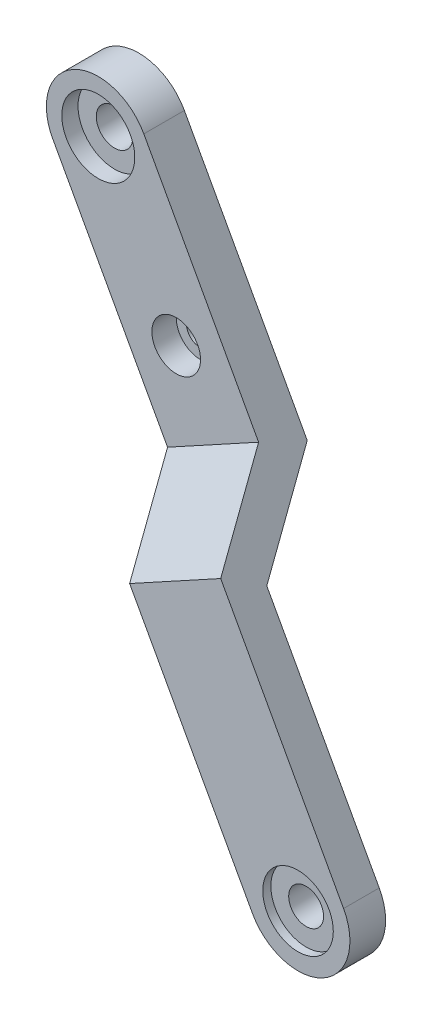
ISO-10303-21;
HEADER;
FILE_DESCRIPTION(('STEP AP214'),'2;1');
FILE_NAME('part.step','',(''),(''),'','','');
FILE_SCHEMA(('AUTOMOTIVE_DESIGN { 1 0 10303 214 1 1 1 1 }'));
ENDSEC;
DATA;
#1=APPLICATION_CONTEXT('core data for automotive mechanical design processes');
#2=APPLICATION_PROTOCOL_DEFINITION('international standard','automotive_design',2000,#1);
#3=PRODUCT_CONTEXT('',#1,'mechanical');
#4=PRODUCT('Part','Part','',(#3));
#5=PRODUCT_RELATED_PRODUCT_CATEGORY('part','',(#4));
#6=PRODUCT_DEFINITION_FORMATION('','',#4);
#7=PRODUCT_DEFINITION_CONTEXT('part definition',#1,'design');
#8=PRODUCT_DEFINITION('design','',#6,#7);
#9=PRODUCT_DEFINITION_SHAPE('','',#8);
#10=(LENGTH_UNIT() NAMED_UNIT(*) SI_UNIT(.MILLI.,.METRE.));
#11=(NAMED_UNIT(*) PLANE_ANGLE_UNIT() SI_UNIT($,.RADIAN.));
#12=(NAMED_UNIT(*) SI_UNIT($,.STERADIAN.) SOLID_ANGLE_UNIT());
#13=UNCERTAINTY_MEASURE_WITH_UNIT(LENGTH_MEASURE(1.E-05),#10,'distance_accuracy_value','');
#14=(GEOMETRIC_REPRESENTATION_CONTEXT(3) GLOBAL_UNCERTAINTY_ASSIGNED_CONTEXT((#13)) GLOBAL_UNIT_ASSIGNED_CONTEXT((#10,
#11,#12)) REPRESENTATION_CONTEXT('',''));
#15=CARTESIAN_POINT('',(0.,0.,0.));
#16=DIRECTION('',(0.,0.,1.));
#17=DIRECTION('',(1.,0.,0.));
#18=AXIS2_PLACEMENT_3D('',#15,#16,#17);
#19=CARTESIAN_POINT('',(17.7118385756911,-30.1579272278413,13.));
#20=DIRECTION('',(0.,0.,1.));
#21=DIRECTION('',(1.,0.,0.));
#22=AXIS2_PLACEMENT_3D('',#19,#20,#21);
#23=PLANE('',#22);
#24=CARTESIAN_POINT('',(17.7118385756911,-30.1579272278413,13.));
#25=DIRECTION('',(0.,0.,-1.));
#26=DIRECTION('',(0.,1.,0.));
#27=AXIS2_PLACEMENT_3D('',#24,#25,#26);
#28=CIRCLE('',#27,2.15);
#29=CARTESIAN_POINT('',(17.7118385756911,-28.0079272278413,13.));
#30=VERTEX_POINT('',#29);
#31=EDGE_CURVE('E150',#30,#30,#28,.T.);
#32=ORIENTED_EDGE('',*,*,#31,.T.);
#33=EDGE_LOOP('',(#32));
#34=FACE_BOUND('',#33,.T.);
#35=CARTESIAN_POINT('',(17.7118385756911,-30.1579272278413,13.));
#36=DIRECTION('',(0.,0.,1.));
#37=DIRECTION('',(1.,0.,0.));
#38=AXIS2_PLACEMENT_3D('',#35,#36,#37);
#39=CIRCLE('',#38,4.35);
#40=CARTESIAN_POINT('',(22.0618385756911,-30.1579272278413,13.));
#41=VERTEX_POINT('',#40);
#42=EDGE_CURVE('E19',#41,#41,#39,.T.);
#43=ORIENTED_EDGE('',*,*,#42,.T.);
#44=EDGE_LOOP('',(#43));
#45=FACE_BOUND('',#44,.T.);
#46=ADVANCED_FACE('F16',(#34,#45),#23,.T.);
#47=CARTESIAN_POINT('',(-6.30536368791014,13.6960805186492,2.00000000000001));
#48=DIRECTION('',(0.,0.,1.));
#49=DIRECTION('',(1.,0.,0.));
#50=AXIS2_PLACEMENT_3D('',#47,#48,#49);
#51=CYLINDRICAL_SURFACE('',#50,3.);
#52=CARTESIAN_POINT('',(-6.30536368791014,13.6960805186492,2.00000000000001));
#53=DIRECTION('',(0.,0.,1.));
#54=DIRECTION('',(1.,0.,0.));
#55=AXIS2_PLACEMENT_3D('',#52,#53,#54);
#56=CIRCLE('',#55,3.);
#57=CARTESIAN_POINT('',(-3.30536368791014,13.6960805186492,2.00000000000001));
#58=VERTEX_POINT('',#57);
#59=EDGE_CURVE('E148',#58,#58,#56,.T.);
#60=ORIENTED_EDGE('',*,*,#59,.F.);
#61=EDGE_LOOP('',(#60));
#62=FACE_BOUND('',#61,.T.);
#63=CARTESIAN_POINT('',(-6.30536368791014,13.6960805186492,5.00000000000001));
#64=DIRECTION('',(0.,0.,1.));
#65=DIRECTION('',(1.,0.,0.));
#66=AXIS2_PLACEMENT_3D('',#63,#64,#65);
#67=CIRCLE('',#66,3.);
#68=CARTESIAN_POINT('',(-3.30536368791014,13.6960805186492,5.00000000000001));
#69=VERTEX_POINT('',#68);
#70=EDGE_CURVE('E142',#69,#69,#67,.T.);
#71=ORIENTED_EDGE('',*,*,#70,.T.);
#72=EDGE_LOOP('',(#71));
#73=FACE_BOUND('',#72,.T.);
#74=ADVANCED_FACE('F172',(#62,#73),#51,.F.);
#75=CARTESIAN_POINT('',(-15.9122445933508,31.2376836172453,14.));
#76=DIRECTION('',(0.,0.,-1.));
#77=DIRECTION('',(-1.,0.,0.));
#78=AXIS2_PLACEMENT_3D('',#75,#76,#77);
#79=CYLINDRICAL_SURFACE('',#78,4.5);
#80=CARTESIAN_POINT('',(-15.9122445933508,31.2376836172453,5.));
#81=DIRECTION('',(0.,0.,-1.));
#82=DIRECTION('',(-1.,0.,0.));
#83=AXIS2_PLACEMENT_3D('',#80,#81,#82);
#84=CIRCLE('',#83,4.5);
#85=CARTESIAN_POINT('',(-20.4122445933508,31.2376836172453,5.));
#86=VERTEX_POINT('',#85);
#87=EDGE_CURVE('E139',#86,#86,#84,.F.);
#88=ORIENTED_EDGE('',*,*,#87,.T.);
#89=EDGE_LOOP('',(#88));
#90=FACE_BOUND('',#89,.T.);
#91=CARTESIAN_POINT('',(-15.9122445933508,31.2376836172453,3.));
#92=DIRECTION('',(0.,0.,-1.));
#93=DIRECTION('',(-1.,0.,0.));
#94=AXIS2_PLACEMENT_3D('',#91,#92,#93);
#95=CIRCLE('',#94,4.5);
#96=CARTESIAN_POINT('',(-20.4122445933508,31.2376836172453,3.));
#97=VERTEX_POINT('',#96);
#98=EDGE_CURVE('E145',#97,#97,#95,.F.);
#99=ORIENTED_EDGE('',*,*,#98,.F.);
#100=EDGE_LOOP('',(#99));
#101=FACE_BOUND('',#100,.T.);
#102=ADVANCED_FACE('F161',(#90,#101),#79,.F.);
#103=CARTESIAN_POINT('',(17.7118385756911,-30.1579272278413,13.));
#104=DIRECTION('',(0.,0.,1.));
#105=DIRECTION('',(1.,0.,0.));
#106=AXIS2_PLACEMENT_3D('',#103,#104,#105);
#107=CYLINDRICAL_SURFACE('',#106,4.35);
#108=CARTESIAN_POINT('',(17.7118385756911,-30.1579272278413,14.));
#109=DIRECTION('',(0.,0.,1.));
#110=DIRECTION('',(1.,0.,0.));
#111=AXIS2_PLACEMENT_3D('',#108,#109,#110);
#112=CIRCLE('',#111,4.35);
#113=CARTESIAN_POINT('',(22.0618385756911,-30.1579272278413,14.));
#114=VERTEX_POINT('',#113);
#115=EDGE_CURVE('E135',#114,#114,#112,.F.);
#116=ORIENTED_EDGE('',*,*,#115,.F.);
#117=EDGE_LOOP('',(#116));
#118=FACE_BOUND('',#117,.T.);
#119=ORIENTED_EDGE('',*,*,#42,.F.);
#120=EDGE_LOOP('',(#119));
#121=FACE_BOUND('',#120,.T.);
#122=ADVANCED_FACE('F158',(#118,#121),#107,.F.);
#123=CARTESIAN_POINT('',(17.7118385756911,-30.1579272278413,19.6));
#124=DIRECTION('',(0.,0.,-1.));
#125=DIRECTION('',(0.,1.,0.));
#126=AXIS2_PLACEMENT_3D('',#123,#124,#125);
#127=CYLINDRICAL_SURFACE('',#126,2.15);
#128=CARTESIAN_POINT('',(17.7118385756911,-30.1579272278413,9.60000000000001));
#129=DIRECTION('',(0.,0.,-1.));
#130=DIRECTION('',(0.,1.,0.));
#131=AXIS2_PLACEMENT_3D('',#128,#129,#130);
#132=CIRCLE('',#131,2.15);
#133=CARTESIAN_POINT('',(17.7118385756911,-28.0079272278413,9.60000000000001));
#134=VERTEX_POINT('',#133);
#135=EDGE_CURVE('E97',#134,#134,#132,.F.);
#136=ORIENTED_EDGE('',*,*,#135,.F.);
#137=EDGE_LOOP('',(#136));
#138=FACE_BOUND('',#137,.T.);
#139=ORIENTED_EDGE('',*,*,#31,.F.);
#140=EDGE_LOOP('',(#139));
#141=FACE_BOUND('',#140,.T.);
#142=ADVANCED_FACE('F160',(#138,#141),#127,.F.);
#143=CARTESIAN_POINT('',(-6.30536368791014,13.6960805186492,2.00000000000001));
#144=DIRECTION('',(0.,0.,1.));
#145=DIRECTION('',(1.,0.,0.));
#146=AXIS2_PLACEMENT_3D('',#143,#144,#145);
#147=PLANE('',#146);
#148=ORIENTED_EDGE('',*,*,#59,.T.);
#149=EDGE_LOOP('',(#148));
#150=FACE_BOUND('',#149,.T.);
#151=CARTESIAN_POINT('',(-6.30536368791014,13.6960805186492,2.00000000000001));
#152=DIRECTION('',(0.,0.,1.));
#153=DIRECTION('',(1.,0.,0.));
#154=AXIS2_PLACEMENT_3D('',#151,#152,#153);
#155=CIRCLE('',#154,1.75);
#156=CARTESIAN_POINT('',(-4.55536368791014,13.6960805186492,2.00000000000001));
#157=VERTEX_POINT('',#156);
#158=EDGE_CURVE('E129',#157,#157,#155,.F.);
#159=ORIENTED_EDGE('',*,*,#158,.T.);
#160=EDGE_LOOP('',(#159));
#161=FACE_BOUND('',#160,.T.);
#162=ADVANCED_FACE('F169',(#150,#161),#147,.T.);
#163=CARTESIAN_POINT('',(0.,0.,3.));
#164=DIRECTION('',(0.,0.,1.));
#165=DIRECTION('',(1.,0.,0.));
#166=AXIS2_PLACEMENT_3D('',#163,#164,#165);
#167=PLANE('',#166);
#168=CARTESIAN_POINT('',(-15.9122445933508,31.2376836172453,3.));
#169=DIRECTION('',(0.,0.,-1.));
#170=DIRECTION('',(-1.,0.,0.));
#171=AXIS2_PLACEMENT_3D('',#168,#169,#170);
#172=CIRCLE('',#171,2.25);
#173=CARTESIAN_POINT('',(-18.1622445933508,31.2376836172453,3.));
#174=VERTEX_POINT('',#173);
#175=EDGE_CURVE('E125',#174,#174,#172,.T.);
#176=ORIENTED_EDGE('',*,*,#175,.T.);
#177=EDGE_LOOP('',(#176));
#178=FACE_BOUND('',#177,.T.);
#179=ORIENTED_EDGE('',*,*,#98,.T.);
#180=EDGE_LOOP('',(#179));
#181=FACE_BOUND('',#180,.T.);
#182=ADVANCED_FACE('F221',(#178,#181),#167,.T.);
#183=CARTESIAN_POINT('',(12.8477278693538,7.03622074063853,5.00000000000001));
#184=DIRECTION('',(0.,0.,-1.));
#185=DIRECTION('',(0.,1.,0.));
#186=AXIS2_PLACEMENT_3D('',#183,#184,#185);
#187=PLANE('',#186);
#188=ORIENTED_EDGE('',*,*,#87,.F.);
#189=EDGE_LOOP('',(#188));
#190=FACE_BOUND('',#189,.T.);
#191=DIRECTION('',(-0.48034404527203,0.877080154929811,0.));
#192=VECTOR('',#191,1.);
#193=CARTESIAN_POINT('',(6.53314978372809,3.57796214843691,5.));
#194=LINE('',#193,#192);
#195=CARTESIAN_POINT('',(-10.2987320868656,34.3119947738648,5.));
#196=VERTEX_POINT('',#195);
#197=CARTESIAN_POINT('',(3.85434874853921,8.46929628715619,5.));
#198=VERTEX_POINT('',#197);
#199=EDGE_CURVE('E110',#196,#198,#194,.F.);
#200=ORIENTED_EDGE('',*,*,#199,.F.);
#201=CARTESIAN_POINT('',(-15.9122445933508,31.2376836172453,5.));
#202=DIRECTION('',(0.,0.,-1.));
#203=DIRECTION('',(-1.,0.,0.));
#204=AXIS2_PLACEMENT_3D('',#201,#202,#203);
#205=CIRCLE('',#204,6.40022747628408);
#206=CARTESIAN_POINT('',(-21.5257570998361,28.1633724606258,5.));
#207=VERTEX_POINT('',#206);
#208=EDGE_CURVE('E104',#207,#196,#205,.T.);
#209=ORIENTED_EDGE('',*,*,#208,.F.);
#210=DIRECTION('',(-0.48034404527203,0.877080154929811,0.));
#211=VECTOR('',#210,1.);
#212=CARTESIAN_POINT('',(-4.69387522924246,-2.57066016480208,5.));
#213=LINE('',#212,#211);
#214=CARTESIAN_POINT('',(-7.37267626443134,2.32067397391721,5.));
#215=VERTEX_POINT('',#214);
#216=EDGE_CURVE('E387',#207,#215,#213,.F.);
#217=ORIENTED_EDGE('',*,*,#216,.T.);
#218=DIRECTION('',(0.877080154929811,0.48034404527203,0.));
#219=VECTOR('',#218,1.);
#220=CARTESIAN_POINT('',(-7.37267626443133,2.32067397391721,5.00000000000001));
#221=LINE('',#220,#219);
#222=EDGE_CURVE('E138',#215,#198,#221,.T.);
#223=ORIENTED_EDGE('',*,*,#222,.T.);
#224=EDGE_LOOP('',(#200,#209,#217,#223));
#225=FACE_BOUND('',#224,.T.);
#226=ORIENTED_EDGE('',*,*,#70,.F.);
#227=EDGE_LOOP('',(#226));
#228=FACE_BOUND('',#227,.T.);
#229=ADVANCED_FACE('F217',(#190,#225,#228),#187,.F.);
#230=CARTESIAN_POINT('',(10.3074672385793,11.6745881973227,5.28841911496145));
#231=DIRECTION('',(0.339654531714431,-0.620189325195019,-0.707106781186546));
#232=DIRECTION('',(0.,0.75180116178925,-0.65938987945853));
#233=AXIS2_PLACEMENT_3D('',#230,#231,#232);
#234=PLANE('',#233);
#235=ORIENTED_EDGE('',*,*,#222,.F.);
#236=DIRECTION('',(0.33965453171443,-0.620189325195016,0.707106781186549));
#237=VECTOR('',#236,1.);
#238=CARTESIAN_POINT('',(-7.37267626443134,2.32067397391721,5.));
#239=LINE('',#238,#237);
#240=CARTESIAN_POINT('',(-3.04957985698309,-5.57304742045106,14.));
#241=VERTEX_POINT('',#240);
#242=EDGE_CURVE('E413',#215,#241,#239,.T.);
#243=ORIENTED_EDGE('',*,*,#242,.T.);
#244=DIRECTION('',(-0.877080154929811,-0.48034404527203,0.));
#245=VECTOR('',#244,1.);
#246=CARTESIAN_POINT('',(8.17744515598747,0.57557489278792,14.));
#247=LINE('',#246,#245);
#248=CARTESIAN_POINT('',(8.17744515598747,0.575574892787919,14.));
#249=VERTEX_POINT('',#248);
#250=EDGE_CURVE('E98',#249,#241,#247,.T.);
#251=ORIENTED_EDGE('',*,*,#250,.F.);
#252=DIRECTION('',(0.33965453171443,-0.620189325195016,0.707106781186549));
#253=VECTOR('',#252,1.);
#254=CARTESIAN_POINT('',(3.85434874853921,8.46929628715619,5.));
#255=LINE('',#254,#253);
#256=EDGE_CURVE('E83',#198,#249,#255,.T.);
#257=ORIENTED_EDGE('',*,*,#256,.F.);
#258=EDGE_LOOP('',(#235,#243,#251,#257));
#259=FACE_BOUND('',#258,.T.);
#260=ADVANCED_FACE('F214',(#259),#234,.F.);
#261=CARTESIAN_POINT('',(0.,0.,14.));
#262=DIRECTION('',(0.,0.,1.));
#263=DIRECTION('',(1.,0.,0.));
#264=AXIS2_PLACEMENT_3D('',#261,#262,#263);
#265=PLANE('',#264);
#266=CARTESIAN_POINT('',(17.7118385756911,-30.1579272278413,14.));
#267=DIRECTION('',(0.,0.,-1.));
#268=DIRECTION('',(-1.,0.,0.));
#269=AXIS2_PLACEMENT_3D('',#266,#267,#268);
#270=CIRCLE('',#269,6.40022747628409);
#271=CARTESIAN_POINT('',(23.3253510821764,-27.0836160712218,14.));
#272=VERTEX_POINT('',#271);
#273=CARTESIAN_POINT('',(12.0983260692059,-33.2322383844608,14.));
#274=VERTEX_POINT('',#273);
#275=EDGE_CURVE('E89',#272,#274,#270,.T.);
#276=ORIENTED_EDGE('',*,*,#275,.F.);
#277=DIRECTION('',(-0.48034404527203,0.877080154929811,0.));
#278=VECTOR('',#277,1.);
#279=CARTESIAN_POINT('',(6.53314978372809,3.57796214843691,14.));
#280=LINE('',#279,#278);
#281=EDGE_CURVE('E76',#249,#272,#280,.F.);
#282=ORIENTED_EDGE('',*,*,#281,.F.);
#283=ORIENTED_EDGE('',*,*,#250,.T.);
#284=DIRECTION('',(-0.48034404527203,0.877080154929811,0.));
#285=VECTOR('',#284,1.);
#286=CARTESIAN_POINT('',(-4.69387522924246,-2.57066016480208,14.));
#287=LINE('',#286,#285);
#288=EDGE_CURVE('E93',#241,#274,#287,.F.);
#289=ORIENTED_EDGE('',*,*,#288,.T.);
#290=EDGE_LOOP('',(#276,#282,#283,#289));
#291=FACE_BOUND('',#290,.T.);
#292=ORIENTED_EDGE('',*,*,#115,.T.);
#293=EDGE_LOOP('',(#292));
#294=FACE_BOUND('',#293,.T.);
#295=ADVANCED_FACE('F90',(#291,#294),#265,.T.);
#296=CARTESIAN_POINT('',(17.7118385756911,-30.1579272278413,14.));
#297=DIRECTION('',(0.,0.,-1.));
#298=DIRECTION('',(-1.,0.,0.));
#299=AXIS2_PLACEMENT_3D('',#296,#297,#298);
#300=CYLINDRICAL_SURFACE('',#299,6.40022747628409);
#301=ORIENTED_EDGE('',*,*,#275,.T.);
#302=DIRECTION('',(0.,0.,1.));
#303=VECTOR('',#302,1.);
#304=CARTESIAN_POINT('',(12.0983260692059,-33.2322383844608,14.));
#305=LINE('',#304,#303);
#306=CARTESIAN_POINT('',(12.0983260692059,-33.2322383844608,9.60000000000001));
#307=VERTEX_POINT('',#306);
#308=EDGE_CURVE('E408',#274,#307,#305,.F.);
#309=ORIENTED_EDGE('',*,*,#308,.T.);
#310=CARTESIAN_POINT('',(17.7118385756911,-30.1579272278413,9.60000000000001));
#311=DIRECTION('',(0.,0.,-1.));
#312=DIRECTION('',(-1.,0.,0.));
#313=AXIS2_PLACEMENT_3D('',#310,#311,#312);
#314=CIRCLE('',#313,6.40022747628409);
#315=CARTESIAN_POINT('',(23.3253510821764,-27.0836160712218,9.60000000000001));
#316=VERTEX_POINT('',#315);
#317=EDGE_CURVE('E101',#316,#307,#314,.T.);
#318=ORIENTED_EDGE('',*,*,#317,.F.);
#319=DIRECTION('',(0.,0.,1.));
#320=VECTOR('',#319,1.);
#321=CARTESIAN_POINT('',(23.3253510821764,-27.0836160712218,14.));
#322=LINE('',#321,#320);
#323=EDGE_CURVE('E80',#272,#316,#322,.F.);
#324=ORIENTED_EDGE('',*,*,#323,.F.);
#325=EDGE_LOOP('',(#301,#309,#318,#324));
#326=FACE_BOUND('',#325,.T.);
#327=ADVANCED_FACE('F100',(#326),#300,.T.);
#328=CARTESIAN_POINT('',(12.8477278693538,7.03622074063853,9.60000000000001));
#329=DIRECTION('',(0.,0.,-1.));
#330=DIRECTION('',(0.,1.,0.));
#331=AXIS2_PLACEMENT_3D('',#328,#329,#330);
#332=PLANE('',#331);
#333=DIRECTION('',(-0.877080154929811,-0.48034404527203,0.));
#334=VECTOR('',#333,1.);
#335=CARTESIAN_POINT('',(9.46047667393484,-1.76716567747108,9.6));
#336=LINE('',#335,#334);
#337=CARTESIAN_POINT('',(9.46047667393484,-1.76716567747108,9.60000000000001));
#338=VERTEX_POINT('',#337);
#339=CARTESIAN_POINT('',(-1.76654833903572,-7.91578799071006,9.60000000000001));
#340=VERTEX_POINT('',#339);
#341=EDGE_CURVE('E392',#338,#340,#336,.T.);
#342=ORIENTED_EDGE('',*,*,#341,.F.);
#343=DIRECTION('',(-0.48034404527203,0.877080154929811,0.));
#344=VECTOR('',#343,1.);
#345=CARTESIAN_POINT('',(6.53314978372809,3.57796214843691,9.60000000000001));
#346=LINE('',#345,#344);
#347=EDGE_CURVE('E128',#316,#338,#346,.T.);
#348=ORIENTED_EDGE('',*,*,#347,.F.);
#349=ORIENTED_EDGE('',*,*,#317,.T.);
#350=DIRECTION('',(-0.48034404527203,0.877080154929811,0.));
#351=VECTOR('',#350,1.);
#352=CARTESIAN_POINT('',(-4.69387522924246,-2.57066016480208,9.60000000000001));
#353=LINE('',#352,#351);
#354=EDGE_CURVE('E403',#307,#340,#353,.T.);
#355=ORIENTED_EDGE('',*,*,#354,.T.);
#356=EDGE_LOOP('',(#342,#348,#349,#355));
#357=FACE_BOUND('',#356,.T.);
#358=ORIENTED_EDGE('',*,*,#135,.T.);
#359=EDGE_LOOP('',(#358));
#360=FACE_BOUND('',#359,.T.);
#361=ADVANCED_FACE('F205',(#357,#360),#332,.T.);
#362=CARTESIAN_POINT('',(-6.30536368791014,13.6960805186492,-4.99999999999999));
#363=DIRECTION('',(0.,0.,1.));
#364=DIRECTION('',(1.,0.,0.));
#365=AXIS2_PLACEMENT_3D('',#362,#363,#364);
#366=CYLINDRICAL_SURFACE('',#365,1.75);
#367=CARTESIAN_POINT('',(-6.30536368791014,13.6960805186492,0.));
#368=DIRECTION('',(0.,0.,1.));
#369=DIRECTION('',(1.,0.,0.));
#370=AXIS2_PLACEMENT_3D('',#367,#368,#369);
#371=CIRCLE('',#370,1.75);
#372=CARTESIAN_POINT('',(-4.55536368791014,13.6960805186492,0.));
#373=VERTEX_POINT('',#372);
#374=EDGE_CURVE('E119',#373,#373,#371,.F.);
#375=ORIENTED_EDGE('',*,*,#374,.T.);
#376=EDGE_LOOP('',(#375));
#377=FACE_BOUND('',#376,.T.);
#378=ORIENTED_EDGE('',*,*,#158,.F.);
#379=EDGE_LOOP('',(#378));
#380=FACE_BOUND('',#379,.T.);
#381=ADVANCED_FACE('F201',(#377,#380),#366,.F.);
#382=CARTESIAN_POINT('',(-15.9122445933508,31.2376836172453,3.));
#383=DIRECTION('',(0.,0.,-1.));
#384=DIRECTION('',(-1.,0.,0.));
#385=AXIS2_PLACEMENT_3D('',#382,#383,#384);
#386=CYLINDRICAL_SURFACE('',#385,2.25);
#387=CARTESIAN_POINT('',(-15.9122445933508,31.2376836172453,0.));
#388=DIRECTION('',(0.,0.,-1.));
#389=DIRECTION('',(-1.,0.,0.));
#390=AXIS2_PLACEMENT_3D('',#387,#388,#389);
#391=CIRCLE('',#390,2.25);
#392=CARTESIAN_POINT('',(-18.1622445933508,31.2376836172453,0.));
#393=VERTEX_POINT('',#392);
#394=EDGE_CURVE('E116',#393,#393,#391,.T.);
#395=ORIENTED_EDGE('',*,*,#394,.T.);
#396=EDGE_LOOP('',(#395));
#397=FACE_BOUND('',#396,.T.);
#398=ORIENTED_EDGE('',*,*,#175,.F.);
#399=EDGE_LOOP('',(#398));
#400=FACE_BOUND('',#399,.T.);
#401=ADVANCED_FACE('F198',(#397,#400),#386,.F.);
#402=CARTESIAN_POINT('',(6.53314978372809,3.57796214843691,14.));
#403=DIRECTION('',(0.877080154929811,0.48034404527203,0.));
#404=DIRECTION('',(-0.48034404527203,0.877080154929811,0.));
#405=AXIS2_PLACEMENT_3D('',#402,#403,#404);
#406=PLANE('',#405);
#407=ORIENTED_EDGE('',*,*,#281,.T.);
#408=ORIENTED_EDGE('',*,*,#323,.T.);
#409=ORIENTED_EDGE('',*,*,#347,.T.);
#410=DIRECTION('',(0.33965453171443,-0.620189325195016,0.707106781186549));
#411=VECTOR('',#410,1.);
#412=CARTESIAN_POINT('',(4.84917383932336,6.65280380985508,0.));
#413=LINE('',#412,#411);
#414=CARTESIAN_POINT('',(4.84917383932336,6.65280380985508,0.));
#415=VERTEX_POINT('',#414);
#416=EDGE_CURVE('E122',#415,#338,#413,.T.);
#417=ORIENTED_EDGE('',*,*,#416,.F.);
#418=DIRECTION('',(-0.48034404527203,0.877080154929811,0.));
#419=VECTOR('',#418,1.);
#420=CARTESIAN_POINT('',(4.84917383932336,6.65280380985508,0.));
#421=LINE('',#420,#419);
#422=CARTESIAN_POINT('',(-10.2987320868656,34.3119947738648,0.));
#423=VERTEX_POINT('',#422);
#424=EDGE_CURVE('E115',#415,#423,#421,.T.);
#425=ORIENTED_EDGE('',*,*,#424,.T.);
#426=DIRECTION('',(0.,0.,-1.));
#427=VECTOR('',#426,1.);
#428=CARTESIAN_POINT('',(-10.2987320868656,34.3119947738648,14.));
#429=LINE('',#428,#427);
#430=EDGE_CURVE('E102',#196,#423,#429,.T.);
#431=ORIENTED_EDGE('',*,*,#430,.F.);
#432=ORIENTED_EDGE('',*,*,#199,.T.);
#433=ORIENTED_EDGE('',*,*,#256,.T.);
#434=EDGE_LOOP('',(#407,#408,#409,#417,#425,#431,#432,#433));
#435=FACE_BOUND('',#434,.T.);
#436=ADVANCED_FACE('F78',(#435),#406,.T.);
#437=CARTESIAN_POINT('',(-15.9122445933508,31.2376836172453,14.));
#438=DIRECTION('',(0.,0.,-1.));
#439=DIRECTION('',(-1.,0.,0.));
#440=AXIS2_PLACEMENT_3D('',#437,#438,#439);
#441=CYLINDRICAL_SURFACE('',#440,6.40022747628408);
#442=CARTESIAN_POINT('',(-15.9122445933508,31.2376836172453,0.));
#443=DIRECTION('',(0.,0.,-1.));
#444=DIRECTION('',(-1.,0.,0.));
#445=AXIS2_PLACEMENT_3D('',#442,#443,#444);
#446=CIRCLE('',#445,6.40022747628408);
#447=CARTESIAN_POINT('',(-21.5257570998361,28.1633724606258,0.));
#448=VERTEX_POINT('',#447);
#449=EDGE_CURVE('E113',#423,#448,#446,.F.);
#450=ORIENTED_EDGE('',*,*,#449,.T.);
#451=DIRECTION('',(0.,0.,1.));
#452=VECTOR('',#451,1.);
#453=CARTESIAN_POINT('',(-21.5257570998361,28.1633724606258,14.));
#454=LINE('',#453,#452);
#455=EDGE_CURVE('E124',#448,#207,#454,.T.);
#456=ORIENTED_EDGE('',*,*,#455,.T.);
#457=ORIENTED_EDGE('',*,*,#208,.T.);
#458=ORIENTED_EDGE('',*,*,#430,.T.);
#459=EDGE_LOOP('',(#450,#456,#457,#458));
#460=FACE_BOUND('',#459,.T.);
#461=ADVANCED_FACE('F191',(#460),#441,.T.);
#462=CARTESIAN_POINT('',(-4.69387522924246,-2.57066016480208,14.));
#463=DIRECTION('',(0.877080154929811,0.48034404527203,0.));
#464=DIRECTION('',(-0.48034404527203,0.877080154929811,0.));
#465=AXIS2_PLACEMENT_3D('',#462,#463,#464);
#466=PLANE('',#465);
#467=ORIENTED_EDGE('',*,*,#354,.F.);
#468=ORIENTED_EDGE('',*,*,#308,.F.);
#469=ORIENTED_EDGE('',*,*,#288,.F.);
#470=ORIENTED_EDGE('',*,*,#242,.F.);
#471=ORIENTED_EDGE('',*,*,#216,.F.);
#472=ORIENTED_EDGE('',*,*,#455,.F.);
#473=DIRECTION('',(0.48034404527203,-0.877080154929812,0.));
#474=VECTOR('',#473,1.);
#475=CARTESIAN_POINT('',(-21.5257570998361,28.1633724606258,0.));
#476=LINE('',#475,#474);
#477=CARTESIAN_POINT('',(-6.37785117364719,0.504181496616098,0.));
#478=VERTEX_POINT('',#477);
#479=EDGE_CURVE('E25',#448,#478,#476,.T.);
#480=ORIENTED_EDGE('',*,*,#479,.T.);
#481=DIRECTION('',(-0.33965453171443,0.620189325195016,-0.707106781186549));
#482=VECTOR('',#481,1.);
#483=CARTESIAN_POINT('',(-1.76654833903572,-7.91578799071006,9.6));
#484=LINE('',#483,#482);
#485=EDGE_CURVE('E33',#340,#478,#484,.T.);
#486=ORIENTED_EDGE('',*,*,#485,.F.);
#487=EDGE_LOOP('',(#467,#468,#469,#470,#471,#472,#480,#486));
#488=FACE_BOUND('',#487,.T.);
#489=ADVANCED_FACE('F184',(#488),#466,.F.);
#490=CARTESIAN_POINT('',(12.0057398971514,8.57364157134762,1.75288520902872));
#491=DIRECTION('',(0.339654531714431,-0.620189325195019,-0.707106781186546));
#492=DIRECTION('',(0.,0.75180116178925,-0.65938987945853));
#493=AXIS2_PLACEMENT_3D('',#490,#491,#492);
#494=PLANE('',#493);
#495=DIRECTION('',(0.877080154929811,0.48034404527203,0.));
#496=VECTOR('',#495,1.);
#497=CARTESIAN_POINT('',(-6.37785117364719,0.504181496616099,0.));
#498=LINE('',#497,#496);
#499=EDGE_CURVE('E11',#478,#415,#498,.T.);
#500=ORIENTED_EDGE('',*,*,#499,.T.);
#501=ORIENTED_EDGE('',*,*,#416,.T.);
#502=ORIENTED_EDGE('',*,*,#341,.T.);
#503=ORIENTED_EDGE('',*,*,#485,.T.);
#504=EDGE_LOOP('',(#500,#501,#502,#503));
#505=FACE_BOUND('',#504,.T.);
#506=ADVANCED_FACE('F178',(#505),#494,.T.);
#507=CARTESIAN_POINT('',(0.,0.,0.));
#508=DIRECTION('',(0.,0.,1.));
#509=DIRECTION('',(1.,0.,0.));
#510=AXIS2_PLACEMENT_3D('',#507,#508,#509);
#511=PLANE('',#510);
#512=ORIENTED_EDGE('',*,*,#479,.F.);
#513=ORIENTED_EDGE('',*,*,#449,.F.);
#514=ORIENTED_EDGE('',*,*,#424,.F.);
#515=ORIENTED_EDGE('',*,*,#499,.F.);
#516=EDGE_LOOP('',(#512,#513,#514,#515));
#517=FACE_BOUND('',#516,.T.);
#518=ORIENTED_EDGE('',*,*,#394,.F.);
#519=EDGE_LOOP('',(#518));
#520=FACE_BOUND('',#519,.T.);
#521=ORIENTED_EDGE('',*,*,#374,.F.);
#522=EDGE_LOOP('',(#521));
#523=FACE_BOUND('',#522,.T.);
#524=ADVANCED_FACE('F176',(#517,#520,#523),#511,.F.);
#525=CLOSED_SHELL('',(#46,#74,#102,#122,#142,#162,#182,#229,#260,#295,#327,#361,#381,#401,#436,
#461,#489,#506,#524));
#526=MANIFOLD_SOLID_BREP('B1',#525);
#527=ADVANCED_BREP_SHAPE_REPRESENTATION('',(#18,#526),#14);
#528=SHAPE_DEFINITION_REPRESENTATION(#9,#527);
ENDSEC;
END-ISO-10303-21;
